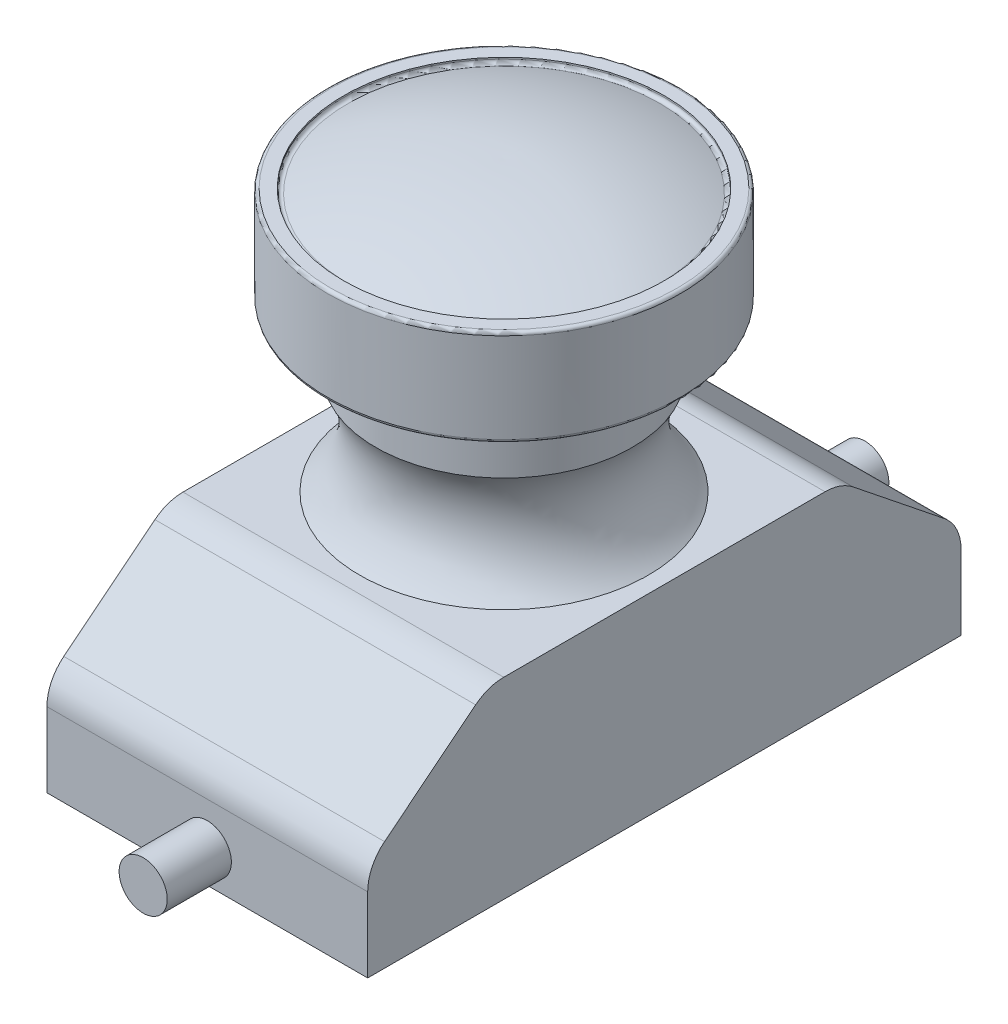
ISO-10303-21;
HEADER;
FILE_DESCRIPTION(('STEP AP214'),'2;1');
FILE_NAME('part.step','',(''),(''),'','','');
FILE_SCHEMA(('AUTOMOTIVE_DESIGN { 1 0 10303 214 1 1 1 1 }'));
ENDSEC;
DATA;
#1=APPLICATION_CONTEXT('core data for automotive mechanical design processes');
#2=APPLICATION_PROTOCOL_DEFINITION('international standard','automotive_design',2000,#1);
#3=PRODUCT_CONTEXT('',#1,'mechanical');
#4=PRODUCT('Part','Part','',(#3));
#5=PRODUCT_RELATED_PRODUCT_CATEGORY('part','',(#4));
#6=PRODUCT_DEFINITION_FORMATION('','',#4);
#7=PRODUCT_DEFINITION_CONTEXT('part definition',#1,'design');
#8=PRODUCT_DEFINITION('design','',#6,#7);
#9=PRODUCT_DEFINITION_SHAPE('','',#8);
#10=(LENGTH_UNIT() NAMED_UNIT(*) SI_UNIT(.MILLI.,.METRE.));
#11=(NAMED_UNIT(*) PLANE_ANGLE_UNIT() SI_UNIT($,.RADIAN.));
#12=(NAMED_UNIT(*) SI_UNIT($,.STERADIAN.) SOLID_ANGLE_UNIT());
#13=UNCERTAINTY_MEASURE_WITH_UNIT(LENGTH_MEASURE(1.E-05),#10,'distance_accuracy_value','');
#14=(GEOMETRIC_REPRESENTATION_CONTEXT(3) GLOBAL_UNCERTAINTY_ASSIGNED_CONTEXT((#13)) GLOBAL_UNIT_ASSIGNED_CONTEXT((#10,
#11,#12)) REPRESENTATION_CONTEXT('',''));
#15=CARTESIAN_POINT('',(0.,0.,0.));
#16=DIRECTION('',(0.,0.,1.));
#17=DIRECTION('',(1.,0.,0.));
#18=AXIS2_PLACEMENT_3D('',#15,#16,#17);
#19=CARTESIAN_POINT('',(5.,0.,9.25));
#20=DIRECTION('',(0.,0.,-1.));
#21=DIRECTION('',(0.,1.,0.));
#22=AXIS2_PLACEMENT_3D('',#19,#20,#21);
#23=PLANE('',#22);
#24=CARTESIAN_POINT('',(0.,1.00000000000001,9.25));
#25=DIRECTION('',(0.,0.,-1.));
#26=DIRECTION('',(0.,1.,0.));
#27=AXIS2_PLACEMENT_3D('',#24,#25,#26);
#28=CIRCLE('',#27,0.75);
#29=CARTESIAN_POINT('',(0.,1.75000000000001,9.25));
#30=VERTEX_POINT('',#29);
#31=EDGE_CURVE('E334',#30,#30,#28,.T.);
#32=ORIENTED_EDGE('',*,*,#31,.T.);
#33=EDGE_LOOP('',(#32));
#34=FACE_BOUND('',#33,.T.);
#35=DIRECTION('',(0.,-1.,0.));
#36=VECTOR('',#35,1.);
#37=CARTESIAN_POINT('',(5.,0.,9.25));
#38=LINE('',#37,#36);
#39=CARTESIAN_POINT('',(5.,2.3271252135188,9.25));
#40=VERTEX_POINT('',#39);
#41=CARTESIAN_POINT('',(5.,0.,9.25));
#42=VERTEX_POINT('',#41);
#43=EDGE_CURVE('E216',#40,#42,#38,.T.);
#44=ORIENTED_EDGE('',*,*,#43,.F.);
#45=DIRECTION('',(-1.,0.,0.));
#46=VECTOR('',#45,1.);
#47=CARTESIAN_POINT('',(5.,2.3271252135188,9.25));
#48=LINE('',#47,#46);
#49=CARTESIAN_POINT('',(-5.,2.3271252135188,9.25));
#50=VERTEX_POINT('',#49);
#51=EDGE_CURVE('E259',#40,#50,#48,.T.);
#52=ORIENTED_EDGE('',*,*,#51,.T.);
#53=DIRECTION('',(0.,-1.,0.));
#54=VECTOR('',#53,1.);
#55=CARTESIAN_POINT('',(-5.,0.,9.25));
#56=LINE('',#55,#54);
#57=CARTESIAN_POINT('',(-5.,0.,9.25));
#58=VERTEX_POINT('',#57);
#59=EDGE_CURVE('E224',#50,#58,#56,.T.);
#60=ORIENTED_EDGE('',*,*,#59,.T.);
#61=DIRECTION('',(-1.,0.,0.));
#62=VECTOR('',#61,1.);
#63=CARTESIAN_POINT('',(5.,0.,9.25));
#64=LINE('',#63,#62);
#65=EDGE_CURVE('E239',#42,#58,#64,.T.);
#66=ORIENTED_EDGE('',*,*,#65,.F.);
#67=EDGE_LOOP('',(#44,#52,#60,#66));
#68=FACE_BOUND('',#67,.T.);
#69=ADVANCED_FACE('F43',(#34,#68),#23,.F.);
#70=CARTESIAN_POINT('',(5.,0.,9.25));
#71=DIRECTION('',(0.,1.,0.));
#72=DIRECTION('',(0.,0.,1.));
#73=AXIS2_PLACEMENT_3D('',#70,#71,#72);
#74=PLANE('',#73);
#75=DIRECTION('',(0.,0.,-1.));
#76=VECTOR('',#75,1.);
#77=CARTESIAN_POINT('',(-5.,0.,9.25));
#78=LINE('',#77,#76);
#79=CARTESIAN_POINT('',(-5.,0.,-9.25));
#80=VERTEX_POINT('',#79);
#81=EDGE_CURVE('E226',#58,#80,#78,.T.);
#82=ORIENTED_EDGE('',*,*,#81,.T.);
#83=DIRECTION('',(-1.,0.,0.));
#84=VECTOR('',#83,1.);
#85=CARTESIAN_POINT('',(5.,0.,-9.25));
#86=LINE('',#85,#84);
#87=CARTESIAN_POINT('',(5.,0.,-9.25));
#88=VERTEX_POINT('',#87);
#89=EDGE_CURVE('E223',#88,#80,#86,.T.);
#90=ORIENTED_EDGE('',*,*,#89,.F.);
#91=DIRECTION('',(0.,0.,-1.));
#92=VECTOR('',#91,1.);
#93=CARTESIAN_POINT('',(5.,0.,9.25));
#94=LINE('',#93,#92);
#95=EDGE_CURVE('E210',#42,#88,#94,.T.);
#96=ORIENTED_EDGE('',*,*,#95,.F.);
#97=ORIENTED_EDGE('',*,*,#65,.T.);
#98=EDGE_LOOP('',(#82,#90,#96,#97));
#99=FACE_BOUND('',#98,.T.);
#100=ADVANCED_FACE('F142',(#99),#74,.F.);
#101=CARTESIAN_POINT('',(5.,3.,-9.25));
#102=DIRECTION('',(0.,0.,1.));
#103=DIRECTION('',(0.,-1.,0.));
#104=AXIS2_PLACEMENT_3D('',#101,#102,#103);
#105=PLANE('',#104);
#106=CARTESIAN_POINT('',(0.,1.00000000000001,-9.25));
#107=DIRECTION('',(0.,0.,1.));
#108=DIRECTION('',(0.,-1.,0.));
#109=AXIS2_PLACEMENT_3D('',#106,#107,#108);
#110=CIRCLE('',#109,0.75);
#111=CARTESIAN_POINT('',(0.,0.250000000000005,-9.25));
#112=VERTEX_POINT('',#111);
#113=EDGE_CURVE('E11',#112,#112,#110,.F.);
#114=ORIENTED_EDGE('',*,*,#113,.F.);
#115=EDGE_LOOP('',(#114));
#116=FACE_BOUND('',#115,.T.);
#117=DIRECTION('',(0.,1.,0.));
#118=VECTOR('',#117,1.);
#119=CARTESIAN_POINT('',(-5.,3.,-9.25));
#120=LINE('',#119,#118);
#121=CARTESIAN_POINT('',(-5.,2.3271252135188,-9.25));
#122=VERTEX_POINT('',#121);
#123=EDGE_CURVE('E206',#80,#122,#120,.T.);
#124=ORIENTED_EDGE('',*,*,#123,.T.);
#125=DIRECTION('',(-1.,0.,0.));
#126=VECTOR('',#125,1.);
#127=CARTESIAN_POINT('',(5.,2.3271252135188,-9.25));
#128=LINE('',#127,#126);
#129=CARTESIAN_POINT('',(5.,2.3271252135188,-9.25));
#130=VERTEX_POINT('',#129);
#131=EDGE_CURVE('E51',#122,#130,#128,.F.);
#132=ORIENTED_EDGE('',*,*,#131,.T.);
#133=DIRECTION('',(0.,1.,0.));
#134=VECTOR('',#133,1.);
#135=CARTESIAN_POINT('',(5.,3.,-9.25));
#136=LINE('',#135,#134);
#137=EDGE_CURVE('E204',#88,#130,#136,.T.);
#138=ORIENTED_EDGE('',*,*,#137,.F.);
#139=ORIENTED_EDGE('',*,*,#89,.T.);
#140=EDGE_LOOP('',(#124,#132,#138,#139));
#141=FACE_BOUND('',#140,.T.);
#142=ADVANCED_FACE('F148',(#116,#141),#105,.F.);
#143=CARTESIAN_POINT('',(5.,6.,-5.5));
#144=DIRECTION('',(0.,-0.78086880944303,0.624695047554425));
#145=DIRECTION('',(0.,-0.624695047554425,-0.78086880944303));
#146=AXIS2_PLACEMENT_3D('',#143,#144,#145);
#147=PLANE('',#146);
#148=DIRECTION('',(0.,0.624695047554425,0.78086880944303));
#149=VECTOR('',#148,1.);
#150=CARTESIAN_POINT('',(5.,6.,-5.5));
#151=LINE('',#150,#149);
#152=CARTESIAN_POINT('',(5.,3.42034154673904,-8.72457306657619));
#153=VERTEX_POINT('',#152);
#154=CARTESIAN_POINT('',(5.,5.69321633322024,-5.8834795834747));
#155=VERTEX_POINT('',#154);
#156=EDGE_CURVE('E212',#153,#155,#151,.T.);
#157=ORIENTED_EDGE('',*,*,#156,.F.);
#158=DIRECTION('',(-1.,0.,0.));
#159=VECTOR('',#158,1.);
#160=CARTESIAN_POINT('',(5.,3.42034154673905,-8.72457306657619));
#161=LINE('',#160,#159);
#162=CARTESIAN_POINT('',(-5.,3.42034154673904,-8.72457306657619));
#163=VERTEX_POINT('',#162);
#164=EDGE_CURVE('E182',#153,#163,#161,.T.);
#165=ORIENTED_EDGE('',*,*,#164,.T.);
#166=DIRECTION('',(0.,0.624695047554425,0.78086880944303));
#167=VECTOR('',#166,1.);
#168=CARTESIAN_POINT('',(-5.,6.,-5.5));
#169=LINE('',#168,#167);
#170=CARTESIAN_POINT('',(-5.,5.69321633322024,-5.8834795834747));
#171=VERTEX_POINT('',#170);
#172=EDGE_CURVE('E230',#163,#171,#169,.T.);
#173=ORIENTED_EDGE('',*,*,#172,.T.);
#174=DIRECTION('',(-1.,0.,0.));
#175=VECTOR('',#174,1.);
#176=CARTESIAN_POINT('',(5.,5.69321633322024,-5.8834795834747));
#177=LINE('',#176,#175);
#178=EDGE_CURVE('E198',#171,#155,#177,.F.);
#179=ORIENTED_EDGE('',*,*,#178,.T.);
#180=EDGE_LOOP('',(#157,#165,#173,#179));
#181=FACE_BOUND('',#180,.T.);
#182=ADVANCED_FACE('F289',(#181),#147,.F.);
#183=CARTESIAN_POINT('',(5.,6.,5.5));
#184=DIRECTION('',(0.,-1.,0.));
#185=DIRECTION('',(0.,0.,-1.));
#186=AXIS2_PLACEMENT_3D('',#183,#184,#185);
#187=PLANE('',#186);
#188=CARTESIAN_POINT('',(0.,6.,0.));
#189=DIRECTION('',(0.,-1.,0.));
#190=DIRECTION('',(0.,0.,-1.));
#191=AXIS2_PLACEMENT_3D('',#188,#189,#190);
#192=CIRCLE('',#191,4.5);
#193=CARTESIAN_POINT('',(0.,6.,-4.5));
#194=VERTEX_POINT('',#193);
#195=EDGE_CURVE('E227',#194,#194,#192,.T.);
#196=ORIENTED_EDGE('',*,*,#195,.T.);
#197=EDGE_LOOP('',(#196));
#198=FACE_BOUND('',#197,.T.);
#199=DIRECTION('',(0.,0.,1.));
#200=VECTOR('',#199,1.);
#201=CARTESIAN_POINT('',(-5.,6.,5.5));
#202=LINE('',#201,#200);
#203=CARTESIAN_POINT('',(-5.,6.,-5.0089065168985));
#204=VERTEX_POINT('',#203);
#205=CARTESIAN_POINT('',(-5.,6.,5.0089065168985));
#206=VERTEX_POINT('',#205);
#207=EDGE_CURVE('E233',#204,#206,#202,.T.);
#208=ORIENTED_EDGE('',*,*,#207,.T.);
#209=DIRECTION('',(-1.,0.,0.));
#210=VECTOR('',#209,1.);
#211=CARTESIAN_POINT('',(5.,6.,5.0089065168985));
#212=LINE('',#211,#210);
#213=CARTESIAN_POINT('',(5.,6.,5.0089065168985));
#214=VERTEX_POINT('',#213);
#215=EDGE_CURVE('E58',#206,#214,#212,.F.);
#216=ORIENTED_EDGE('',*,*,#215,.T.);
#217=DIRECTION('',(0.,0.,1.));
#218=VECTOR('',#217,1.);
#219=CARTESIAN_POINT('',(5.,6.,5.5));
#220=LINE('',#219,#218);
#221=CARTESIAN_POINT('',(5.,6.,-5.0089065168985));
#222=VERTEX_POINT('',#221);
#223=EDGE_CURVE('E214',#222,#214,#220,.T.);
#224=ORIENTED_EDGE('',*,*,#223,.F.);
#225=DIRECTION('',(-1.,0.,0.));
#226=VECTOR('',#225,1.);
#227=CARTESIAN_POINT('',(5.,6.,-5.0089065168985));
#228=LINE('',#227,#226);
#229=EDGE_CURVE('E194',#222,#204,#228,.T.);
#230=ORIENTED_EDGE('',*,*,#229,.T.);
#231=EDGE_LOOP('',(#208,#216,#224,#230));
#232=FACE_BOUND('',#231,.T.);
#233=ADVANCED_FACE('F293',(#198,#232),#187,.F.);
#234=CARTESIAN_POINT('',(5.,3.,9.25));
#235=DIRECTION('',(0.,-0.78086880944303,-0.624695047554425));
#236=DIRECTION('',(0.,0.624695047554425,-0.78086880944303));
#237=AXIS2_PLACEMENT_3D('',#234,#235,#236);
#238=PLANE('',#237);
#239=DIRECTION('',(0.,-0.624695047554425,0.78086880944303));
#240=VECTOR('',#239,1.);
#241=CARTESIAN_POINT('',(-5.,3.,9.25));
#242=LINE('',#241,#240);
#243=CARTESIAN_POINT('',(-5.,5.69321633322024,5.8834795834747));
#244=VERTEX_POINT('',#243);
#245=CARTESIAN_POINT('',(-5.,3.42034154673905,8.72457306657619));
#246=VERTEX_POINT('',#245);
#247=EDGE_CURVE('E235',#244,#246,#242,.T.);
#248=ORIENTED_EDGE('',*,*,#247,.T.);
#249=DIRECTION('',(-1.,0.,0.));
#250=VECTOR('',#249,1.);
#251=CARTESIAN_POINT('',(5.,3.42034154673905,8.72457306657619));
#252=LINE('',#251,#250);
#253=CARTESIAN_POINT('',(5.,3.42034154673905,8.72457306657619));
#254=VERTEX_POINT('',#253);
#255=EDGE_CURVE('E189',#246,#254,#252,.F.);
#256=ORIENTED_EDGE('',*,*,#255,.T.);
#257=DIRECTION('',(0.,-0.624695047554425,0.78086880944303));
#258=VECTOR('',#257,1.);
#259=CARTESIAN_POINT('',(5.,3.,9.25));
#260=LINE('',#259,#258);
#261=CARTESIAN_POINT('',(5.,5.69321633322024,5.8834795834747));
#262=VERTEX_POINT('',#261);
#263=EDGE_CURVE('E221',#262,#254,#260,.T.);
#264=ORIENTED_EDGE('',*,*,#263,.F.);
#265=DIRECTION('',(-1.,0.,0.));
#266=VECTOR('',#265,1.);
#267=CARTESIAN_POINT('',(5.,5.69321633322024,5.8834795834747));
#268=LINE('',#267,#266);
#269=EDGE_CURVE('E270',#262,#244,#268,.T.);
#270=ORIENTED_EDGE('',*,*,#269,.T.);
#271=EDGE_LOOP('',(#248,#256,#264,#270));
#272=FACE_BOUND('',#271,.T.);
#273=ADVANCED_FACE('F275',(#272),#238,.F.);
#274=CARTESIAN_POINT('',(5.,0.,0.));
#275=DIRECTION('',(-1.,0.,0.));
#276=DIRECTION('',(0.,0.,1.));
#277=AXIS2_PLACEMENT_3D('',#274,#275,#276);
#278=PLANE('',#277);
#279=ORIENTED_EDGE('',*,*,#263,.T.);
#280=CARTESIAN_POINT('',(5.,2.3271252135188,7.85));
#281=DIRECTION('',(-1.,0.,0.));
#282=DIRECTION('',(0.,0.,1.));
#283=AXIS2_PLACEMENT_3D('',#280,#281,#282);
#284=CIRCLE('',#283,1.4);
#285=EDGE_CURVE('E187',#254,#40,#284,.F.);
#286=ORIENTED_EDGE('',*,*,#285,.T.);
#287=ORIENTED_EDGE('',*,*,#43,.T.);
#288=ORIENTED_EDGE('',*,*,#95,.T.);
#289=ORIENTED_EDGE('',*,*,#137,.T.);
#290=CARTESIAN_POINT('',(5.,2.3271252135188,-7.85));
#291=DIRECTION('',(-1.,0.,0.));
#292=DIRECTION('',(0.,0.,1.));
#293=AXIS2_PLACEMENT_3D('',#290,#291,#292);
#294=CIRCLE('',#293,1.4);
#295=EDGE_CURVE('E180',#130,#153,#294,.F.);
#296=ORIENTED_EDGE('',*,*,#295,.T.);
#297=ORIENTED_EDGE('',*,*,#156,.T.);
#298=CARTESIAN_POINT('',(5.,4.6,-5.0089065168985));
#299=DIRECTION('',(-1.,0.,0.));
#300=DIRECTION('',(0.,0.,1.));
#301=AXIS2_PLACEMENT_3D('',#298,#299,#300);
#302=CIRCLE('',#301,1.4);
#303=EDGE_CURVE('E65',#155,#222,#302,.F.);
#304=ORIENTED_EDGE('',*,*,#303,.T.);
#305=ORIENTED_EDGE('',*,*,#223,.T.);
#306=CARTESIAN_POINT('',(5.,4.6,5.0089065168985));
#307=DIRECTION('',(-1.,0.,0.));
#308=DIRECTION('',(0.,0.,1.));
#309=AXIS2_PLACEMENT_3D('',#306,#307,#308);
#310=CIRCLE('',#309,1.4);
#311=EDGE_CURVE('E185',#214,#262,#310,.F.);
#312=ORIENTED_EDGE('',*,*,#311,.T.);
#313=EDGE_LOOP('',(#279,#286,#287,#288,#289,#296,#297,#304,#305,#312));
#314=FACE_BOUND('',#313,.T.);
#315=ADVANCED_FACE('F208',(#314),#278,.F.);
#316=CARTESIAN_POINT('',(-5.,0.,0.));
#317=DIRECTION('',(-1.,0.,0.));
#318=DIRECTION('',(0.,0.,1.));
#319=AXIS2_PLACEMENT_3D('',#316,#317,#318);
#320=PLANE('',#319);
#321=ORIENTED_EDGE('',*,*,#59,.F.);
#322=CARTESIAN_POINT('',(-5.,2.3271252135188,7.85));
#323=DIRECTION('',(-1.,0.,0.));
#324=DIRECTION('',(0.,0.,1.));
#325=AXIS2_PLACEMENT_3D('',#322,#323,#324);
#326=CIRCLE('',#325,1.4);
#327=EDGE_CURVE('E268',#50,#246,#326,.T.);
#328=ORIENTED_EDGE('',*,*,#327,.T.);
#329=ORIENTED_EDGE('',*,*,#247,.F.);
#330=CARTESIAN_POINT('',(-5.,4.6,5.0089065168985));
#331=DIRECTION('',(-1.,0.,0.));
#332=DIRECTION('',(0.,0.,1.));
#333=AXIS2_PLACEMENT_3D('',#330,#331,#332);
#334=CIRCLE('',#333,1.4);
#335=EDGE_CURVE('E266',#244,#206,#334,.T.);
#336=ORIENTED_EDGE('',*,*,#335,.T.);
#337=ORIENTED_EDGE('',*,*,#207,.F.);
#338=CARTESIAN_POINT('',(-5.,4.6,-5.0089065168985));
#339=DIRECTION('',(-1.,0.,0.));
#340=DIRECTION('',(0.,0.,1.));
#341=AXIS2_PLACEMENT_3D('',#338,#339,#340);
#342=CIRCLE('',#341,1.4);
#343=EDGE_CURVE('E262',#204,#171,#342,.T.);
#344=ORIENTED_EDGE('',*,*,#343,.T.);
#345=ORIENTED_EDGE('',*,*,#172,.F.);
#346=CARTESIAN_POINT('',(-5.,2.3271252135188,-7.85));
#347=DIRECTION('',(-1.,0.,0.));
#348=DIRECTION('',(0.,0.,1.));
#349=AXIS2_PLACEMENT_3D('',#346,#347,#348);
#350=CIRCLE('',#349,1.4);
#351=EDGE_CURVE('E264',#163,#122,#350,.T.);
#352=ORIENTED_EDGE('',*,*,#351,.T.);
#353=ORIENTED_EDGE('',*,*,#123,.F.);
#354=ORIENTED_EDGE('',*,*,#81,.F.);
#355=EDGE_LOOP('',(#321,#328,#329,#336,#337,#344,#345,#352,#353,#354));
#356=FACE_BOUND('',#355,.T.);
#357=ADVANCED_FACE('F286',(#356),#320,.T.);
#358=CARTESIAN_POINT('',(0.,7.89402615915736,0.));
#359=DIRECTION('',(0.,-1.,0.));
#360=DIRECTION('',(0.,0.,-1.));
#361=AXIS2_PLACEMENT_3D('',#358,#359,#360);
#362=TOROIDAL_SURFACE('',#361,6.13176741860708,2.5);
#363=CARTESIAN_POINT('',(0.,9.2,0.));
#364=DIRECTION('',(0.,-1.,0.));
#365=DIRECTION('',(0.,0.,-1.));
#366=AXIS2_PLACEMENT_3D('',#363,#364,#365);
#367=CIRCLE('',#366,4.);
#368=CARTESIAN_POINT('',(0.,9.2,-4.));
#369=VERTEX_POINT('',#368);
#370=EDGE_CURVE('E346',#369,#369,#367,.T.);
#371=ORIENTED_EDGE('',*,*,#370,.T.);
#372=EDGE_LOOP('',(#371));
#373=FACE_BOUND('',#372,.T.);
#374=ORIENTED_EDGE('',*,*,#195,.F.);
#375=EDGE_LOOP('',(#374));
#376=FACE_BOUND('',#375,.T.);
#377=ADVANCED_FACE('F351',(#373,#376),#362,.F.);
#378=CARTESIAN_POINT('',(0.,6.,0.));
#379=DIRECTION('',(0.,-1.,0.));
#380=DIRECTION('',(0.,0.,-1.));
#381=AXIS2_PLACEMENT_3D('',#378,#379,#380);
#382=CYLINDRICAL_SURFACE('',#381,4.);
#383=CARTESIAN_POINT('',(0.,11.2,0.));
#384=DIRECTION('',(0.,-1.,0.));
#385=DIRECTION('',(0.,0.,-1.));
#386=AXIS2_PLACEMENT_3D('',#383,#384,#385);
#387=CIRCLE('',#386,4.);
#388=CARTESIAN_POINT('',(0.,11.2,-4.));
#389=VERTEX_POINT('',#388);
#390=EDGE_CURVE('E343',#389,#389,#387,.T.);
#391=ORIENTED_EDGE('',*,*,#390,.T.);
#392=EDGE_LOOP('',(#391));
#393=FACE_BOUND('',#392,.T.);
#394=ORIENTED_EDGE('',*,*,#370,.F.);
#395=EDGE_LOOP('',(#394));
#396=FACE_BOUND('',#395,.T.);
#397=ADVANCED_FACE('F353',(#393,#396),#382,.T.);
#398=CARTESIAN_POINT('',(0.,11.2,-5.5));
#399=DIRECTION('',(0.,-1.,0.));
#400=DIRECTION('',(0.,0.,-1.));
#401=AXIS2_PLACEMENT_3D('',#398,#399,#400);
#402=PLANE('',#401);
#403=CARTESIAN_POINT('',(0.,11.2,0.));
#404=DIRECTION('',(0.,-1.,0.));
#405=DIRECTION('',(0.,0.,-1.));
#406=AXIS2_PLACEMENT_3D('',#403,#404,#405);
#407=CIRCLE('',#406,5.4);
#408=CARTESIAN_POINT('',(0.,11.2,-5.4));
#409=VERTEX_POINT('',#408);
#410=EDGE_CURVE('E242',#409,#409,#407,.T.);
#411=ORIENTED_EDGE('',*,*,#410,.T.);
#412=EDGE_LOOP('',(#411));
#413=FACE_BOUND('',#412,.T.);
#414=ORIENTED_EDGE('',*,*,#390,.F.);
#415=EDGE_LOOP('',(#414));
#416=FACE_BOUND('',#415,.T.);
#417=ADVANCED_FACE('F360',(#413,#416),#402,.T.);
#418=CARTESIAN_POINT('',(0.,6.,0.));
#419=DIRECTION('',(0.,-1.,0.));
#420=DIRECTION('',(0.,0.,-1.));
#421=AXIS2_PLACEMENT_3D('',#418,#419,#420);
#422=CYLINDRICAL_SURFACE('',#421,5.5);
#423=CARTESIAN_POINT('',(0.,11.3,0.));
#424=DIRECTION('',(0.,-1.,0.));
#425=DIRECTION('',(0.,0.,-1.));
#426=AXIS2_PLACEMENT_3D('',#423,#424,#425);
#427=CIRCLE('',#426,5.5);
#428=CARTESIAN_POINT('',(0.,11.3,-5.5));
#429=VERTEX_POINT('',#428);
#430=EDGE_CURVE('E248',#429,#429,#427,.F.);
#431=ORIENTED_EDGE('',*,*,#430,.T.);
#432=EDGE_LOOP('',(#431));
#433=FACE_BOUND('',#432,.T.);
#434=CARTESIAN_POINT('',(0.,14.1,0.));
#435=DIRECTION('',(0.,1.,0.));
#436=DIRECTION('',(0.,0.,1.));
#437=AXIS2_PLACEMENT_3D('',#434,#435,#436);
#438=CIRCLE('',#437,5.5);
#439=CARTESIAN_POINT('',(0.,14.1,5.5));
#440=VERTEX_POINT('',#439);
#441=EDGE_CURVE('E245',#440,#440,#438,.F.);
#442=ORIENTED_EDGE('',*,*,#441,.T.);
#443=EDGE_LOOP('',(#442));
#444=FACE_BOUND('',#443,.T.);
#445=ADVANCED_FACE('F453',(#433,#444),#422,.T.);
#446=CARTESIAN_POINT('',(0.,14.2,-5.));
#447=DIRECTION('',(0.,1.,0.));
#448=DIRECTION('',(0.,0.,1.));
#449=AXIS2_PLACEMENT_3D('',#446,#447,#448);
#450=PLANE('',#449);
#451=CARTESIAN_POINT('',(0.,14.2,0.));
#452=DIRECTION('',(0.,1.,0.));
#453=DIRECTION('',(0.,0.,1.));
#454=AXIS2_PLACEMENT_3D('',#451,#452,#453);
#455=CIRCLE('',#454,5.4);
#456=CARTESIAN_POINT('',(0.,14.2,5.4));
#457=VERTEX_POINT('',#456);
#458=EDGE_CURVE('E251',#457,#457,#455,.T.);
#459=ORIENTED_EDGE('',*,*,#458,.T.);
#460=EDGE_LOOP('',(#459));
#461=FACE_BOUND('',#460,.T.);
#462=CARTESIAN_POINT('',(0.,14.2,0.));
#463=DIRECTION('',(0.,-1.,0.));
#464=DIRECTION('',(0.,0.,-1.));
#465=AXIS2_PLACEMENT_3D('',#462,#463,#464);
#466=CIRCLE('',#465,5.);
#467=CARTESIAN_POINT('',(0.,14.2,-5.));
#468=VERTEX_POINT('',#467);
#469=EDGE_CURVE('E337',#468,#468,#466,.T.);
#470=ORIENTED_EDGE('',*,*,#469,.T.);
#471=EDGE_LOOP('',(#470));
#472=FACE_BOUND('',#471,.T.);
#473=ADVANCED_FACE('F136',(#461,#472),#450,.T.);
#474=CARTESIAN_POINT('',(0.,6.,0.));
#475=DIRECTION('',(0.,-1.,0.));
#476=DIRECTION('',(0.,0.,-1.));
#477=AXIS2_PLACEMENT_3D('',#474,#475,#476);
#478=CYLINDRICAL_SURFACE('',#477,5.);
#479=CARTESIAN_POINT('',(0.,14.151701238125,0.));
#480=DIRECTION('',(0.,-1.,0.));
#481=DIRECTION('',(0.,0.,-1.));
#482=AXIS2_PLACEMENT_3D('',#479,#480,#481);
#483=CIRCLE('',#482,5.);
#484=CARTESIAN_POINT('',(0.,14.151701238125,-5.));
#485=VERTEX_POINT('',#484);
#486=EDGE_CURVE('E254',#485,#485,#483,.T.);
#487=ORIENTED_EDGE('',*,*,#486,.T.);
#488=EDGE_LOOP('',(#487));
#489=FACE_BOUND('',#488,.T.);
#490=ORIENTED_EDGE('',*,*,#469,.F.);
#491=EDGE_LOOP('',(#490));
#492=FACE_BOUND('',#491,.T.);
#493=ADVANCED_FACE('F126',(#489,#492),#478,.F.);
#494=CARTESIAN_POINT('',(0.,3.00167236240251,-0.200334472480498));
#495=DIRECTION('',(-1.,0.,0.));
#496=DIRECTION('',(0.,0.,-1.));
#497=AXIS2_PLACEMENT_3D('',#494,#495,#496);
#498=CIRCLE('',#497,12.);
#499=TRIMMED_CURVE('',#498,(PARAMETER_VALUE(-1.58749164174817)),
(PARAMETER_VALUE(1.58749164174817)),.T.,.PARAMETER.);
#500=CARTESIAN_POINT('',(0.,3.00167236240251,0.));
#501=DIRECTION('',(0.,-1.,0.));
#502=AXIS1_PLACEMENT('',#500,#501);
#503=SURFACE_OF_REVOLUTION('',#499,#502);
#504=CARTESIAN_POINT('',(0.,14.0595522391521,0.));
#505=DIRECTION('',(0.,-1.,0.));
#506=DIRECTION('',(0.,0.,-1.));
#507=AXIS2_PLACEMENT_3D('',#504,#505,#506);
#508=CIRCLE('',#507,4.86115978902876);
#509=CARTESIAN_POINT('',(0.,14.0595522391521,-4.86115978902876));
#510=VERTEX_POINT('',#509);
#511=EDGE_CURVE('E257',#510,#510,#508,.F.);
#512=ORIENTED_EDGE('',*,*,#511,.T.);
#513=EDGE_LOOP('',(#512));
#514=FACE_BOUND('',#513,.T.);
#515=CARTESIAN_POINT('',(0.,15.,0.));
#516=VERTEX_POINT('',#515);
#517=VERTEX_LOOP('',#516);
#518=FACE_BOUND('',#517,.T.);
#519=ADVANCED_FACE('F123',(#514,#518),#503,.T.);
#520=CARTESIAN_POINT('',(0.,11.3,0.));
#521=DIRECTION('',(0.,-1.,0.));
#522=DIRECTION('',(0.,0.,-1.));
#523=AXIS2_PLACEMENT_3D('',#520,#521,#522);
#524=TOROIDAL_SURFACE('',#523,5.4,0.1);
#525=ORIENTED_EDGE('',*,*,#430,.F.);
#526=EDGE_LOOP('',(#525));
#527=FACE_BOUND('',#526,.T.);
#528=ORIENTED_EDGE('',*,*,#410,.F.);
#529=EDGE_LOOP('',(#528));
#530=FACE_BOUND('',#529,.T.);
#531=ADVANCED_FACE('F125',(#527,#530),#524,.T.);
#532=CARTESIAN_POINT('',(0.,14.1,0.));
#533=DIRECTION('',(0.,1.,0.));
#534=DIRECTION('',(0.,0.,1.));
#535=AXIS2_PLACEMENT_3D('',#532,#533,#534);
#536=TOROIDAL_SURFACE('',#535,5.4,0.1);
#537=ORIENTED_EDGE('',*,*,#458,.F.);
#538=EDGE_LOOP('',(#537));
#539=FACE_BOUND('',#538,.T.);
#540=ORIENTED_EDGE('',*,*,#441,.F.);
#541=EDGE_LOOP('',(#540));
#542=FACE_BOUND('',#541,.T.);
#543=ADVANCED_FACE('F133',(#539,#542),#536,.T.);
#544=CARTESIAN_POINT('',(0.,14.151701238125,0.));
#545=DIRECTION('',(0.,-1.,0.));
#546=DIRECTION('',(0.,0.,-1.));
#547=AXIS2_PLACEMENT_3D('',#544,#545,#546);
#548=TOROIDAL_SURFACE('',#547,4.9,0.1);
#549=ORIENTED_EDGE('',*,*,#511,.F.);
#550=EDGE_LOOP('',(#549));
#551=FACE_BOUND('',#550,.T.);
#552=ORIENTED_EDGE('',*,*,#486,.F.);
#553=EDGE_LOOP('',(#552));
#554=FACE_BOUND('',#553,.T.);
#555=ADVANCED_FACE('F157',(#551,#554),#548,.F.);
#556=CARTESIAN_POINT('',(5.,2.3271252135188,7.85));
#557=DIRECTION('',(-1.,0.,0.));
#558=DIRECTION('',(0.,0.,1.));
#559=AXIS2_PLACEMENT_3D('',#556,#557,#558);
#560=CYLINDRICAL_SURFACE('',#559,1.4);
#561=ORIENTED_EDGE('',*,*,#285,.F.);
#562=ORIENTED_EDGE('',*,*,#255,.F.);
#563=ORIENTED_EDGE('',*,*,#327,.F.);
#564=ORIENTED_EDGE('',*,*,#51,.F.);
#565=EDGE_LOOP('',(#561,#562,#563,#564));
#566=FACE_BOUND('',#565,.T.);
#567=ADVANCED_FACE('F161',(#566),#560,.T.);
#568=CARTESIAN_POINT('',(5.,4.6,5.0089065168985));
#569=DIRECTION('',(-1.,0.,0.));
#570=DIRECTION('',(0.,0.,1.));
#571=AXIS2_PLACEMENT_3D('',#568,#569,#570);
#572=CYLINDRICAL_SURFACE('',#571,1.4);
#573=ORIENTED_EDGE('',*,*,#311,.F.);
#574=ORIENTED_EDGE('',*,*,#215,.F.);
#575=ORIENTED_EDGE('',*,*,#335,.F.);
#576=ORIENTED_EDGE('',*,*,#269,.F.);
#577=EDGE_LOOP('',(#573,#574,#575,#576));
#578=FACE_BOUND('',#577,.T.);
#579=ADVANCED_FACE('F165',(#578),#572,.T.);
#580=CARTESIAN_POINT('',(5.,2.3271252135188,-7.85));
#581=DIRECTION('',(-1.,0.,0.));
#582=DIRECTION('',(0.,0.,1.));
#583=AXIS2_PLACEMENT_3D('',#580,#581,#582);
#584=CYLINDRICAL_SURFACE('',#583,1.4);
#585=ORIENTED_EDGE('',*,*,#295,.F.);
#586=ORIENTED_EDGE('',*,*,#131,.F.);
#587=ORIENTED_EDGE('',*,*,#351,.F.);
#588=ORIENTED_EDGE('',*,*,#164,.F.);
#589=EDGE_LOOP('',(#585,#586,#587,#588));
#590=FACE_BOUND('',#589,.T.);
#591=ADVANCED_FACE('F168',(#590),#584,.T.);
#592=CARTESIAN_POINT('',(5.,4.6,-5.0089065168985));
#593=DIRECTION('',(-1.,0.,0.));
#594=DIRECTION('',(0.,0.,1.));
#595=AXIS2_PLACEMENT_3D('',#592,#593,#594);
#596=CYLINDRICAL_SURFACE('',#595,1.4);
#597=ORIENTED_EDGE('',*,*,#303,.F.);
#598=ORIENTED_EDGE('',*,*,#178,.F.);
#599=ORIENTED_EDGE('',*,*,#343,.F.);
#600=ORIENTED_EDGE('',*,*,#229,.F.);
#601=EDGE_LOOP('',(#597,#598,#599,#600));
#602=FACE_BOUND('',#601,.T.);
#603=ADVANCED_FACE('F45',(#602),#596,.T.);
#604=CARTESIAN_POINT('',(0.,1.00000000000001,-11.25));
#605=DIRECTION('',(0.,0.,1.));
#606=DIRECTION('',(0.,-1.,0.));
#607=AXIS2_PLACEMENT_3D('',#604,#605,#606);
#608=CYLINDRICAL_SURFACE('',#607,0.75);
#609=CARTESIAN_POINT('',(0.,1.00000000000001,-11.25));
#610=DIRECTION('',(0.,0.,-1.));
#611=DIRECTION('',(0.,1.,0.));
#612=AXIS2_PLACEMENT_3D('',#609,#610,#611);
#613=CIRCLE('',#612,0.75);
#614=CARTESIAN_POINT('',(0.,1.75000000000001,-11.25));
#615=VERTEX_POINT('',#614);
#616=EDGE_CURVE('E333',#615,#615,#613,.T.);
#617=ORIENTED_EDGE('',*,*,#616,.F.);
#618=EDGE_LOOP('',(#617));
#619=FACE_BOUND('',#618,.T.);
#620=ORIENTED_EDGE('',*,*,#113,.T.);
#621=EDGE_LOOP('',(#620));
#622=FACE_BOUND('',#621,.T.);
#623=ADVANCED_FACE('F175',(#619,#622),#608,.T.);
#624=CARTESIAN_POINT('',(0.,1.00000000000001,-11.25));
#625=DIRECTION('',(0.,0.,-1.));
#626=DIRECTION('',(0.,1.,0.));
#627=AXIS2_PLACEMENT_3D('',#624,#625,#626);
#628=PLANE('',#627);
#629=ORIENTED_EDGE('',*,*,#616,.T.);
#630=EDGE_LOOP('',(#629));
#631=FACE_BOUND('',#630,.T.);
#632=ADVANCED_FACE('F312',(#631),#628,.T.);
#633=CARTESIAN_POINT('',(0.,1.00000000000001,11.25));
#634=DIRECTION('',(0.,0.,-1.));
#635=DIRECTION('',(0.,1.,0.));
#636=AXIS2_PLACEMENT_3D('',#633,#634,#635);
#637=CYLINDRICAL_SURFACE('',#636,0.75);
#638=CARTESIAN_POINT('',(0.,1.00000000000001,11.25));
#639=DIRECTION('',(0.,0.,-1.));
#640=DIRECTION('',(0.,1.,0.));
#641=AXIS2_PLACEMENT_3D('',#638,#639,#640);
#642=CIRCLE('',#641,0.75);
#643=CARTESIAN_POINT('',(0.,1.75000000000001,11.25));
#644=VERTEX_POINT('',#643);
#645=EDGE_CURVE('E332',#644,#644,#642,.T.);
#646=ORIENTED_EDGE('',*,*,#645,.T.);
#647=EDGE_LOOP('',(#646));
#648=FACE_BOUND('',#647,.T.);
#649=ORIENTED_EDGE('',*,*,#31,.F.);
#650=EDGE_LOOP('',(#649));
#651=FACE_BOUND('',#650,.T.);
#652=ADVANCED_FACE('F317',(#648,#651),#637,.T.);
#653=CARTESIAN_POINT('',(0.,1.00000000000001,11.25));
#654=DIRECTION('',(0.,0.,1.));
#655=DIRECTION('',(0.,1.,0.));
#656=AXIS2_PLACEMENT_3D('',#653,#654,#655);
#657=PLANE('',#656);
#658=ORIENTED_EDGE('',*,*,#645,.F.);
#659=EDGE_LOOP('',(#658));
#660=FACE_BOUND('',#659,.T.);
#661=ADVANCED_FACE('F324',(#660),#657,.T.);
#662=CLOSED_SHELL('',(#69,#100,#142,#182,#233,#273,#315,#357,#377,#397,#417,#445,#473,#493,#519,
#531,#543,#555,#567,#579,#591,#603,#623,#632,#652,#661));
#663=MANIFOLD_SOLID_BREP('B2',#662);
#664=ADVANCED_BREP_SHAPE_REPRESENTATION('',(#18,#663),#14);
#665=SHAPE_DEFINITION_REPRESENTATION(#9,#664);
ENDSEC;
END-ISO-10303-21;
